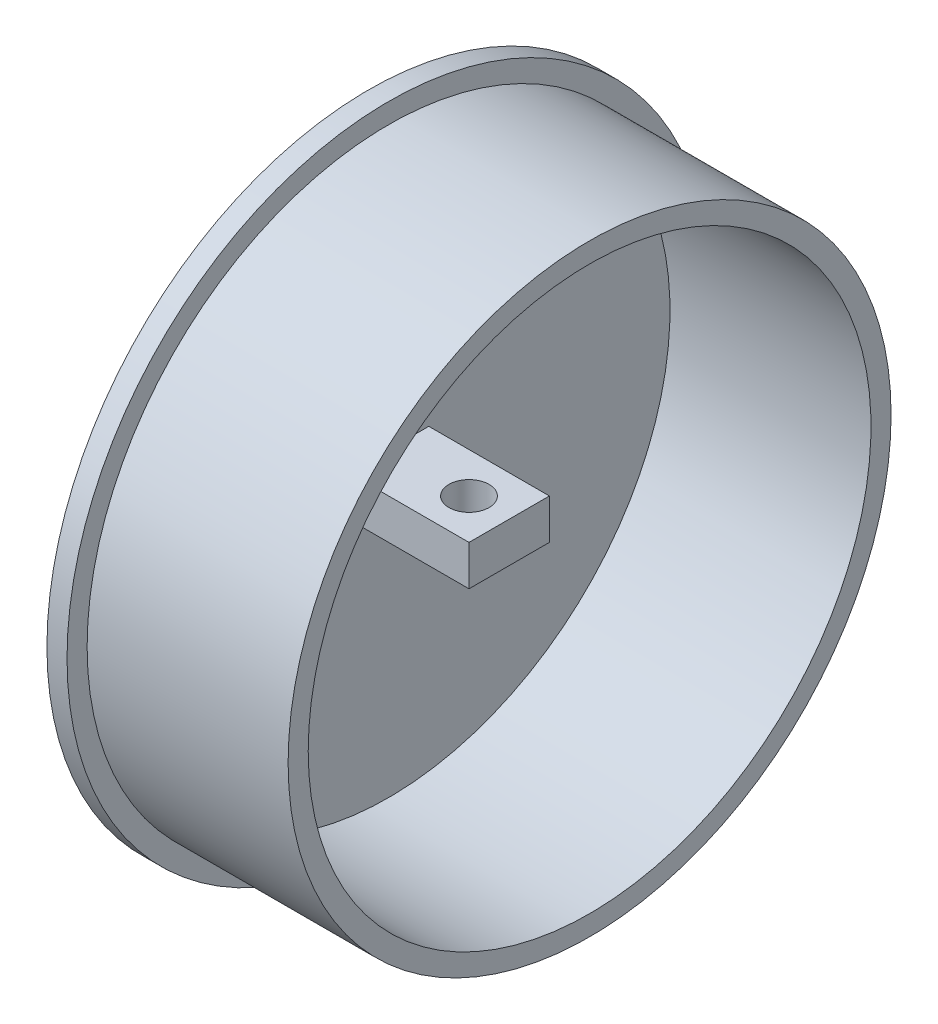
ISO-10303-21;
HEADER;
FILE_DESCRIPTION(('STEP AP214'),'2;1');
FILE_NAME('part.step','',(''),(''),'','','');
FILE_SCHEMA(('AUTOMOTIVE_DESIGN { 1 0 10303 214 1 1 1 1 }'));
ENDSEC;
DATA;
#1=APPLICATION_CONTEXT('core data for automotive mechanical design processes');
#2=APPLICATION_PROTOCOL_DEFINITION('international standard','automotive_design',2000,#1);
#3=PRODUCT_CONTEXT('',#1,'mechanical');
#4=PRODUCT('Part','Part','',(#3));
#5=PRODUCT_RELATED_PRODUCT_CATEGORY('part','',(#4));
#6=PRODUCT_DEFINITION_FORMATION('','',#4);
#7=PRODUCT_DEFINITION_CONTEXT('part definition',#1,'design');
#8=PRODUCT_DEFINITION('design','',#6,#7);
#9=PRODUCT_DEFINITION_SHAPE('','',#8);
#10=(LENGTH_UNIT() NAMED_UNIT(*) SI_UNIT(.MILLI.,.METRE.));
#11=(NAMED_UNIT(*) PLANE_ANGLE_UNIT() SI_UNIT($,.RADIAN.));
#12=(NAMED_UNIT(*) SI_UNIT($,.STERADIAN.) SOLID_ANGLE_UNIT());
#13=UNCERTAINTY_MEASURE_WITH_UNIT(LENGTH_MEASURE(1.E-05),#10,'distance_accuracy_value','');
#14=(GEOMETRIC_REPRESENTATION_CONTEXT(3) GLOBAL_UNCERTAINTY_ASSIGNED_CONTEXT((#13)) GLOBAL_UNIT_ASSIGNED_CONTEXT((#10,
#11,#12)) REPRESENTATION_CONTEXT('',''));
#15=CARTESIAN_POINT('',(0.,0.,0.));
#16=DIRECTION('',(0.,0.,1.));
#17=DIRECTION('',(1.,0.,0.));
#18=AXIS2_PLACEMENT_3D('',#15,#16,#17);
#19=CARTESIAN_POINT('',(0.,0.,0.));
#20=DIRECTION('',(-1.,0.,0.));
#21=DIRECTION('',(0.,0.,1.));
#22=AXIS2_PLACEMENT_3D('',#19,#20,#21);
#23=PLANE('',#22);
#24=CARTESIAN_POINT('',(0.,0.,0.));
#25=DIRECTION('',(-1.,0.,0.));
#26=DIRECTION('',(0.,0.,1.));
#27=AXIS2_PLACEMENT_3D('',#24,#25,#26);
#28=CIRCLE('',#27,70.);
#29=CARTESIAN_POINT('',(0.,0.,70.));
#30=VERTEX_POINT('',#29);
#31=EDGE_CURVE('E109',#30,#30,#28,.T.);
#32=ORIENTED_EDGE('',*,*,#31,.F.);
#33=EDGE_LOOP('',(#32));
#34=FACE_BOUND('',#33,.T.);
#35=DIRECTION('',(0.,-1.,0.));
#36=VECTOR('',#35,1.);
#37=CARTESIAN_POINT('',(0.,-5.,10.));
#38=LINE('',#37,#36);
#39=CARTESIAN_POINT('',(0.,5.,10.));
#40=VERTEX_POINT('',#39);
#41=CARTESIAN_POINT('',(0.,-5.,10.));
#42=VERTEX_POINT('',#41);
#43=EDGE_CURVE('E96',#40,#42,#38,.T.);
#44=ORIENTED_EDGE('',*,*,#43,.F.);
#45=DIRECTION('',(0.,0.,1.));
#46=VECTOR('',#45,1.);
#47=CARTESIAN_POINT('',(0.,5.,-10.));
#48=LINE('',#47,#46);
#49=CARTESIAN_POINT('',(0.,5.,-10.));
#50=VERTEX_POINT('',#49);
#51=EDGE_CURVE('E93',#50,#40,#48,.T.);
#52=ORIENTED_EDGE('',*,*,#51,.F.);
#53=DIRECTION('',(0.,1.,0.));
#54=VECTOR('',#53,1.);
#55=CARTESIAN_POINT('',(0.,-5.,-10.));
#56=LINE('',#55,#54);
#57=CARTESIAN_POINT('',(0.,-5.,-10.));
#58=VERTEX_POINT('',#57);
#59=EDGE_CURVE('E55',#58,#50,#56,.T.);
#60=ORIENTED_EDGE('',*,*,#59,.F.);
#61=DIRECTION('',(0.,0.,-1.));
#62=VECTOR('',#61,1.);
#63=CARTESIAN_POINT('',(0.,-5.,-10.));
#64=LINE('',#63,#62);
#65=EDGE_CURVE('E50',#42,#58,#64,.T.);
#66=ORIENTED_EDGE('',*,*,#65,.F.);
#67=EDGE_LOOP('',(#44,#52,#60,#66));
#68=FACE_BOUND('',#67,.T.);
#69=ADVANCED_FACE('F33',(#34,#68),#23,.F.);
#70=CARTESIAN_POINT('',(50.,0.,0.));
#71=DIRECTION('',(1.,0.,0.));
#72=DIRECTION('',(0.,0.,-1.));
#73=AXIS2_PLACEMENT_3D('',#70,#71,#72);
#74=PLANE('',#73);
#75=CARTESIAN_POINT('',(50.,0.,0.));
#76=DIRECTION('',(-1.,0.,0.));
#77=DIRECTION('',(0.,0.,1.));
#78=AXIS2_PLACEMENT_3D('',#75,#76,#77);
#79=CIRCLE('',#78,70.);
#80=CARTESIAN_POINT('',(50.,0.,70.));
#81=VERTEX_POINT('',#80);
#82=EDGE_CURVE('E106',#81,#81,#79,.T.);
#83=ORIENTED_EDGE('',*,*,#82,.T.);
#84=EDGE_LOOP('',(#83));
#85=FACE_BOUND('',#84,.T.);
#86=CARTESIAN_POINT('',(50.,0.,0.));
#87=DIRECTION('',(-1.,0.,0.));
#88=DIRECTION('',(0.,0.,1.));
#89=AXIS2_PLACEMENT_3D('',#86,#87,#88);
#90=CIRCLE('',#89,75.);
#91=CARTESIAN_POINT('',(50.,0.,75.));
#92=VERTEX_POINT('',#91);
#93=EDGE_CURVE('E11',#92,#92,#90,.T.);
#94=ORIENTED_EDGE('',*,*,#93,.F.);
#95=EDGE_LOOP('',(#94));
#96=FACE_BOUND('',#95,.T.);
#97=ADVANCED_FACE('F132',(#85,#96),#74,.T.);
#98=CARTESIAN_POINT('',(0.,0.,0.));
#99=DIRECTION('',(-1.,0.,0.));
#100=DIRECTION('',(0.,0.,1.));
#101=AXIS2_PLACEMENT_3D('',#98,#99,#100);
#102=CYLINDRICAL_SURFACE('',#101,70.);
#103=ORIENTED_EDGE('',*,*,#82,.F.);
#104=EDGE_LOOP('',(#103));
#105=FACE_BOUND('',#104,.T.);
#106=ORIENTED_EDGE('',*,*,#31,.T.);
#107=EDGE_LOOP('',(#106));
#108=FACE_BOUND('',#107,.T.);
#109=ADVANCED_FACE('F137',(#105,#108),#102,.F.);
#110=CARTESIAN_POINT('',(0.,0.,0.));
#111=DIRECTION('',(-1.,0.,0.));
#112=DIRECTION('',(0.,0.,1.));
#113=AXIS2_PLACEMENT_3D('',#110,#111,#112);
#114=CYLINDRICAL_SURFACE('',#113,75.);
#115=ORIENTED_EDGE('',*,*,#93,.T.);
#116=EDGE_LOOP('',(#115));
#117=FACE_BOUND('',#116,.T.);
#118=CARTESIAN_POINT('',(0.,0.,0.));
#119=DIRECTION('',(-1.,0.,0.));
#120=DIRECTION('',(0.,0.,1.));
#121=AXIS2_PLACEMENT_3D('',#118,#119,#120);
#122=CIRCLE('',#121,75.);
#123=CARTESIAN_POINT('',(0.,0.,75.));
#124=VERTEX_POINT('',#123);
#125=EDGE_CURVE('E42',#124,#124,#122,.T.);
#126=ORIENTED_EDGE('',*,*,#125,.F.);
#127=EDGE_LOOP('',(#126));
#128=FACE_BOUND('',#127,.T.);
#129=ADVANCED_FACE('F181',(#117,#128),#114,.T.);
#130=CARTESIAN_POINT('',(-5.,0.,0.));
#131=DIRECTION('',(-1.,0.,0.));
#132=DIRECTION('',(0.,0.,1.));
#133=AXIS2_PLACEMENT_3D('',#130,#131,#132);
#134=PLANE('',#133);
#135=CARTESIAN_POINT('',(-5.,0.,0.));
#136=DIRECTION('',(-1.,0.,0.));
#137=DIRECTION('',(0.,0.,1.));
#138=AXIS2_PLACEMENT_3D('',#135,#136,#137);
#139=CIRCLE('',#138,80.);
#140=CARTESIAN_POINT('',(-5.,0.,80.));
#141=VERTEX_POINT('',#140);
#142=EDGE_CURVE('E100',#141,#141,#139,.T.);
#143=ORIENTED_EDGE('',*,*,#142,.T.);
#144=EDGE_LOOP('',(#143));
#145=FACE_BOUND('',#144,.T.);
#146=ADVANCED_FACE('F35',(#145),#134,.T.);
#147=CARTESIAN_POINT('',(0.,0.,0.));
#148=DIRECTION('',(-1.,0.,0.));
#149=DIRECTION('',(0.,0.,1.));
#150=AXIS2_PLACEMENT_3D('',#147,#148,#149);
#151=CYLINDRICAL_SURFACE('',#150,80.);
#152=ORIENTED_EDGE('',*,*,#142,.F.);
#153=EDGE_LOOP('',(#152));
#154=FACE_BOUND('',#153,.T.);
#155=CARTESIAN_POINT('',(0.,0.,0.));
#156=DIRECTION('',(-1.,0.,0.));
#157=DIRECTION('',(0.,0.,1.));
#158=AXIS2_PLACEMENT_3D('',#155,#156,#157);
#159=CIRCLE('',#158,80.);
#160=CARTESIAN_POINT('',(0.,0.,80.));
#161=VERTEX_POINT('',#160);
#162=EDGE_CURVE('E97',#161,#161,#159,.T.);
#163=ORIENTED_EDGE('',*,*,#162,.T.);
#164=EDGE_LOOP('',(#163));
#165=FACE_BOUND('',#164,.T.);
#166=ADVANCED_FACE('F117',(#154,#165),#151,.T.);
#167=ORIENTED_EDGE('',*,*,#125,.T.);
#168=EDGE_LOOP('',(#167));
#169=FACE_BOUND('',#168,.T.);
#170=ORIENTED_EDGE('',*,*,#162,.F.);
#171=EDGE_LOOP('',(#170));
#172=FACE_BOUND('',#171,.T.);
#173=ADVANCED_FACE('F120',(#169,#172),#23,.F.);
#174=CARTESIAN_POINT('',(30.,-5.,10.));
#175=DIRECTION('',(0.,0.,-1.));
#176=DIRECTION('',(-1.,0.,0.));
#177=AXIS2_PLACEMENT_3D('',#174,#175,#176);
#178=PLANE('',#177);
#179=ORIENTED_EDGE('',*,*,#43,.T.);
#180=DIRECTION('',(-1.,0.,0.));
#181=VECTOR('',#180,1.);
#182=CARTESIAN_POINT('',(30.,-5.,10.));
#183=LINE('',#182,#181);
#184=CARTESIAN_POINT('',(30.,-5.,10.));
#185=VERTEX_POINT('',#184);
#186=EDGE_CURVE('E77',#185,#42,#183,.T.);
#187=ORIENTED_EDGE('',*,*,#186,.F.);
#188=DIRECTION('',(0.,-1.,0.));
#189=VECTOR('',#188,1.);
#190=CARTESIAN_POINT('',(30.,-5.,10.));
#191=LINE('',#190,#189);
#192=CARTESIAN_POINT('',(30.,5.,10.));
#193=VERTEX_POINT('',#192);
#194=EDGE_CURVE('E84',#193,#185,#191,.T.);
#195=ORIENTED_EDGE('',*,*,#194,.F.);
#196=DIRECTION('',(-1.,0.,0.));
#197=VECTOR('',#196,1.);
#198=CARTESIAN_POINT('',(30.,5.,10.));
#199=LINE('',#198,#197);
#200=EDGE_CURVE('E145',#193,#40,#199,.T.);
#201=ORIENTED_EDGE('',*,*,#200,.T.);
#202=EDGE_LOOP('',(#179,#187,#195,#201));
#203=FACE_BOUND('',#202,.T.);
#204=ADVANCED_FACE('F95',(#203),#178,.F.);
#205=CARTESIAN_POINT('',(30.,-5.,-10.));
#206=DIRECTION('',(0.,1.,0.));
#207=DIRECTION('',(0.,0.,1.));
#208=AXIS2_PLACEMENT_3D('',#205,#206,#207);
#209=PLANE('',#208);
#210=CARTESIAN_POINT('',(20.,-5.,0.));
#211=DIRECTION('',(0.,-1.,0.));
#212=DIRECTION('',(0.,0.,-1.));
#213=AXIS2_PLACEMENT_3D('',#210,#211,#212);
#214=CIRCLE('',#213,5.);
#215=CARTESIAN_POINT('',(20.,-5.,-5.));
#216=VERTEX_POINT('',#215);
#217=EDGE_CURVE('E154',#216,#216,#214,.T.);
#218=ORIENTED_EDGE('',*,*,#217,.F.);
#219=EDGE_LOOP('',(#218));
#220=FACE_BOUND('',#219,.T.);
#221=ORIENTED_EDGE('',*,*,#65,.T.);
#222=DIRECTION('',(-1.,0.,0.));
#223=VECTOR('',#222,1.);
#224=CARTESIAN_POINT('',(30.,-5.,-10.));
#225=LINE('',#224,#223);
#226=CARTESIAN_POINT('',(30.,-5.,-10.));
#227=VERTEX_POINT('',#226);
#228=EDGE_CURVE('E80',#227,#58,#225,.T.);
#229=ORIENTED_EDGE('',*,*,#228,.F.);
#230=DIRECTION('',(0.,0.,-1.));
#231=VECTOR('',#230,1.);
#232=CARTESIAN_POINT('',(30.,-5.,-10.));
#233=LINE('',#232,#231);
#234=EDGE_CURVE('E73',#185,#227,#233,.T.);
#235=ORIENTED_EDGE('',*,*,#234,.F.);
#236=ORIENTED_EDGE('',*,*,#186,.T.);
#237=EDGE_LOOP('',(#221,#229,#235,#236));
#238=FACE_BOUND('',#237,.T.);
#239=ADVANCED_FACE('F75',(#220,#238),#209,.F.);
#240=CARTESIAN_POINT('',(30.,-5.,-10.));
#241=DIRECTION('',(0.,0.,1.));
#242=DIRECTION('',(1.,0.,0.));
#243=AXIS2_PLACEMENT_3D('',#240,#241,#242);
#244=PLANE('',#243);
#245=ORIENTED_EDGE('',*,*,#59,.T.);
#246=DIRECTION('',(-1.,0.,0.));
#247=VECTOR('',#246,1.);
#248=CARTESIAN_POINT('',(30.,5.,-10.));
#249=LINE('',#248,#247);
#250=CARTESIAN_POINT('',(30.,5.,-10.));
#251=VERTEX_POINT('',#250);
#252=EDGE_CURVE('E102',#251,#50,#249,.T.);
#253=ORIENTED_EDGE('',*,*,#252,.F.);
#254=DIRECTION('',(0.,1.,0.));
#255=VECTOR('',#254,1.);
#256=CARTESIAN_POINT('',(30.,-5.,-10.));
#257=LINE('',#256,#255);
#258=EDGE_CURVE('E83',#227,#251,#257,.T.);
#259=ORIENTED_EDGE('',*,*,#258,.F.);
#260=ORIENTED_EDGE('',*,*,#228,.T.);
#261=EDGE_LOOP('',(#245,#253,#259,#260));
#262=FACE_BOUND('',#261,.T.);
#263=ADVANCED_FACE('F172',(#262),#244,.F.);
#264=CARTESIAN_POINT('',(30.,5.,-10.));
#265=DIRECTION('',(0.,-1.,0.));
#266=DIRECTION('',(0.,0.,-1.));
#267=AXIS2_PLACEMENT_3D('',#264,#265,#266);
#268=PLANE('',#267);
#269=CARTESIAN_POINT('',(20.,5.,0.));
#270=DIRECTION('',(0.,-1.,0.));
#271=DIRECTION('',(0.,0.,-1.));
#272=AXIS2_PLACEMENT_3D('',#269,#270,#271);
#273=CIRCLE('',#272,5.);
#274=CARTESIAN_POINT('',(20.,5.,-5.));
#275=VERTEX_POINT('',#274);
#276=EDGE_CURVE('E37',#275,#275,#273,.T.);
#277=ORIENTED_EDGE('',*,*,#276,.T.);
#278=EDGE_LOOP('',(#277));
#279=FACE_BOUND('',#278,.T.);
#280=ORIENTED_EDGE('',*,*,#51,.T.);
#281=ORIENTED_EDGE('',*,*,#200,.F.);
#282=DIRECTION('',(0.,0.,1.));
#283=VECTOR('',#282,1.);
#284=CARTESIAN_POINT('',(30.,5.,-10.));
#285=LINE('',#284,#283);
#286=EDGE_CURVE('E89',#251,#193,#285,.T.);
#287=ORIENTED_EDGE('',*,*,#286,.F.);
#288=ORIENTED_EDGE('',*,*,#252,.T.);
#289=EDGE_LOOP('',(#280,#281,#287,#288));
#290=FACE_BOUND('',#289,.T.);
#291=ADVANCED_FACE('F144',(#279,#290),#268,.F.);
#292=CARTESIAN_POINT('',(30.,0.,0.));
#293=DIRECTION('',(1.,0.,0.));
#294=DIRECTION('',(0.,0.,-1.));
#295=AXIS2_PLACEMENT_3D('',#292,#293,#294);
#296=PLANE('',#295);
#297=ORIENTED_EDGE('',*,*,#194,.T.);
#298=ORIENTED_EDGE('',*,*,#234,.T.);
#299=ORIENTED_EDGE('',*,*,#258,.T.);
#300=ORIENTED_EDGE('',*,*,#286,.T.);
#301=EDGE_LOOP('',(#297,#298,#299,#300));
#302=FACE_BOUND('',#301,.T.);
#303=ADVANCED_FACE('F87',(#302),#296,.T.);
#304=CARTESIAN_POINT('',(20.,25.,0.));
#305=DIRECTION('',(0.,-1.,0.));
#306=DIRECTION('',(0.,0.,-1.));
#307=AXIS2_PLACEMENT_3D('',#304,#305,#306);
#308=CYLINDRICAL_SURFACE('',#307,5.);
#309=ORIENTED_EDGE('',*,*,#217,.T.);
#310=EDGE_LOOP('',(#309));
#311=FACE_BOUND('',#310,.T.);
#312=ORIENTED_EDGE('',*,*,#276,.F.);
#313=EDGE_LOOP('',(#312));
#314=FACE_BOUND('',#313,.T.);
#315=ADVANCED_FACE('F162',(#311,#314),#308,.F.);
#316=CLOSED_SHELL('',(#69,#97,#109,#129,#146,#166,#173,#204,#239,#263,#291,#303,#315));
#317=MANIFOLD_SOLID_BREP('B2',#316);
#318=ADVANCED_BREP_SHAPE_REPRESENTATION('',(#18,#317),#14);
#319=SHAPE_DEFINITION_REPRESENTATION(#9,#318);
ENDSEC;
END-ISO-10303-21;
